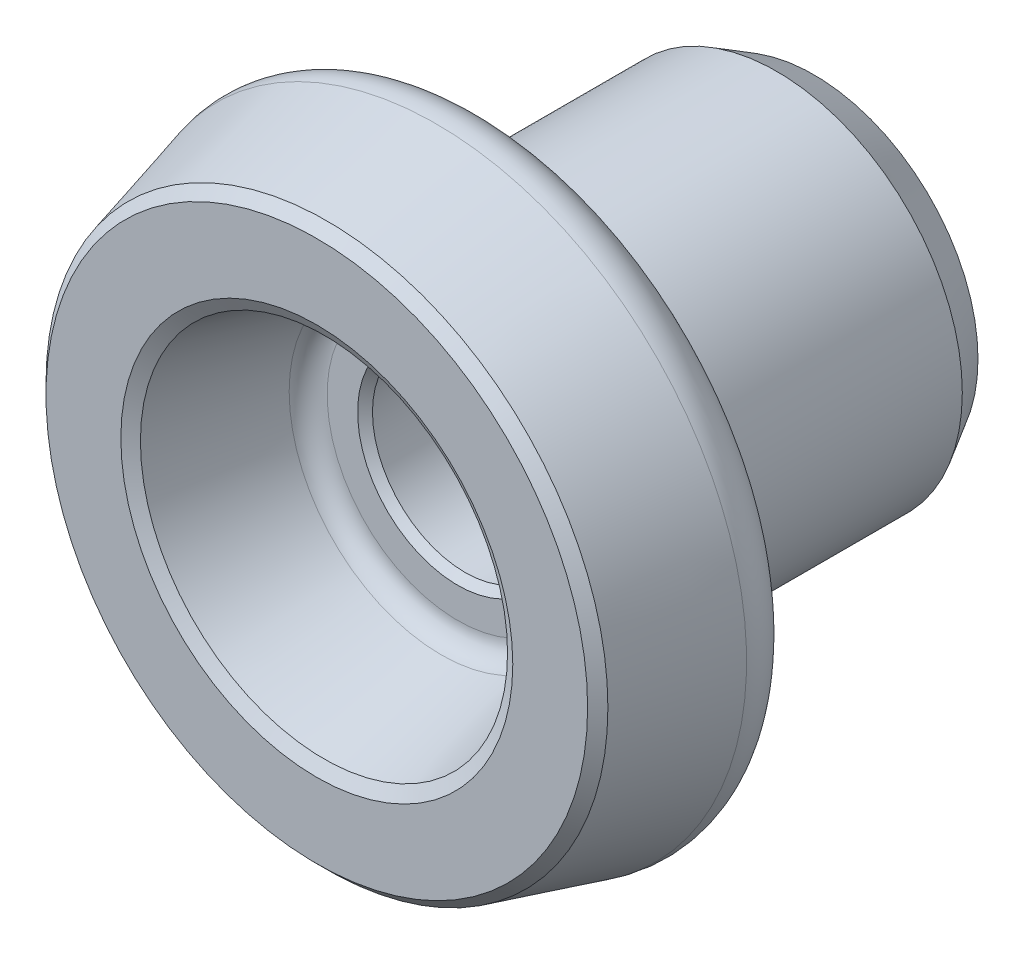
ISO-10303-21;
HEADER;
FILE_DESCRIPTION(('STEP AP214'),'2;1');
FILE_NAME('part.step','',(''),(''),'','','');
FILE_SCHEMA(('AUTOMOTIVE_DESIGN { 1 0 10303 214 1 1 1 1 }'));
ENDSEC;
DATA;
#1=APPLICATION_CONTEXT('core data for automotive mechanical design processes');
#2=APPLICATION_PROTOCOL_DEFINITION('international standard','automotive_design',2000,#1);
#3=PRODUCT_CONTEXT('',#1,'mechanical');
#4=PRODUCT('Part','Part','',(#3));
#5=PRODUCT_RELATED_PRODUCT_CATEGORY('part','',(#4));
#6=PRODUCT_DEFINITION_FORMATION('','',#4);
#7=PRODUCT_DEFINITION_CONTEXT('part definition',#1,'design');
#8=PRODUCT_DEFINITION('design','',#6,#7);
#9=PRODUCT_DEFINITION_SHAPE('','',#8);
#10=(LENGTH_UNIT() NAMED_UNIT(*) SI_UNIT(.MILLI.,.METRE.));
#11=(NAMED_UNIT(*) PLANE_ANGLE_UNIT() SI_UNIT($,.RADIAN.));
#12=(NAMED_UNIT(*) SI_UNIT($,.STERADIAN.) SOLID_ANGLE_UNIT());
#13=UNCERTAINTY_MEASURE_WITH_UNIT(LENGTH_MEASURE(1.E-05),#10,'distance_accuracy_value','');
#14=(GEOMETRIC_REPRESENTATION_CONTEXT(3) GLOBAL_UNCERTAINTY_ASSIGNED_CONTEXT((#13)) GLOBAL_UNIT_ASSIGNED_CONTEXT((#10,
#11,#12)) REPRESENTATION_CONTEXT('',''));
#15=CARTESIAN_POINT('',(0.,0.,0.));
#16=DIRECTION('',(0.,0.,1.));
#17=DIRECTION('',(1.,0.,0.));
#18=AXIS2_PLACEMENT_3D('',#15,#16,#17);
#19=CARTESIAN_POINT('',(0.,0.,-8.05525797624729));
#20=DIRECTION('',(0.,0.,-1.));
#21=DIRECTION('',(-1.,0.,0.));
#22=AXIS2_PLACEMENT_3D('',#19,#20,#21);
#23=CONICAL_SURFACE('',#22,20.9083998695598,0.261799387799146);
#24=CARTESIAN_POINT('',(0.,0.,-0.683012701892222));
#25=DIRECTION('',(0.,0.,1.));
#26=DIRECTION('',(1.,0.,0.));
#27=AXIS2_PLACEMENT_3D('',#24,#25,#26);
#28=CIRCLE('',#27,18.9330127018922);
#29=CARTESIAN_POINT('',(18.9330127018922,0.,-0.683012701892222));
#30=VERTEX_POINT('',#29);
#31=EDGE_CURVE('E68',#30,#30,#28,.F.);
#32=ORIENTED_EDGE('',*,*,#31,.T.);
#33=EDGE_LOOP('',(#32));
#34=FACE_BOUND('',#33,.T.);
#35=CARTESIAN_POINT('',(0.,0.,-8.05525797624729));
#36=DIRECTION('',(0.,0.,-1.));
#37=DIRECTION('',(-1.,0.,0.));
#38=AXIS2_PLACEMENT_3D('',#35,#36,#37);
#39=CIRCLE('',#38,20.9083998695598);
#40=CARTESIAN_POINT('',(-20.9083998695598,0.,-8.05525797624729));
#41=VERTEX_POINT('',#40);
#42=EDGE_CURVE('E92',#41,#41,#39,.T.);
#43=ORIENTED_EDGE('',*,*,#42,.F.);
#44=EDGE_LOOP('',(#43));
#45=FACE_BOUND('',#44,.T.);
#46=ADVANCED_FACE('F39',(#34,#45),#23,.T.);
#47=CARTESIAN_POINT('',(0.,12.5,0.));
#48=DIRECTION('',(0.,0.,1.));
#49=DIRECTION('',(1.,0.,0.));
#50=AXIS2_PLACEMENT_3D('',#47,#48,#49);
#51=PLANE('',#50);
#52=CARTESIAN_POINT('',(0.,0.,0.));
#53=DIRECTION('',(0.,0.,1.));
#54=DIRECTION('',(1.,0.,0.));
#55=AXIS2_PLACEMENT_3D('',#52,#53,#54);
#56=CIRCLE('',#55,18.25);
#57=CARTESIAN_POINT('',(18.25,0.,0.));
#58=VERTEX_POINT('',#57);
#59=EDGE_CURVE('E62',#58,#58,#56,.T.);
#60=ORIENTED_EDGE('',*,*,#59,.T.);
#61=EDGE_LOOP('',(#60));
#62=FACE_BOUND('',#61,.T.);
#63=CARTESIAN_POINT('',(0.,0.,0.));
#64=DIRECTION('',(0.,0.,1.));
#65=DIRECTION('',(1.,0.,0.));
#66=AXIS2_PLACEMENT_3D('',#63,#64,#65);
#67=CIRCLE('',#66,13.2071067811865);
#68=CARTESIAN_POINT('',(13.2071067811865,0.,0.));
#69=VERTEX_POINT('',#68);
#70=EDGE_CURVE('E65',#69,#69,#67,.F.);
#71=ORIENTED_EDGE('',*,*,#70,.T.);
#72=EDGE_LOOP('',(#71));
#73=FACE_BOUND('',#72,.T.);
#74=ADVANCED_FACE('F100',(#62,#73),#51,.T.);
#75=CARTESIAN_POINT('',(0.,0.,0.));
#76=DIRECTION('',(0.,0.,1.));
#77=DIRECTION('',(1.,0.,0.));
#78=AXIS2_PLACEMENT_3D('',#75,#76,#77);
#79=CONICAL_SURFACE('',#78,12.5,0.26179938779915);
#80=CARTESIAN_POINT('',(0.,0.,-8.38822856765378));
#81=DIRECTION('',(0.,0.,1.));
#82=DIRECTION('',(1.,0.,0.));
#83=AXIS2_PLACEMENT_3D('',#80,#81,#82);
#84=CIRCLE('',#83,10.2523809293695);
#85=CARTESIAN_POINT('',(10.2523809293695,0.,-8.38822856765378));
#86=VERTEX_POINT('',#85);
#87=EDGE_CURVE('E54',#86,#86,#84,.F.);
#88=ORIENTED_EDGE('',*,*,#87,.T.);
#89=EDGE_LOOP('',(#88));
#90=FACE_BOUND('',#89,.T.);
#91=CARTESIAN_POINT('',(0.,0.,-0.482962913144536));
#92=DIRECTION('',(0.,0.,-1.));
#93=DIRECTION('',(-1.,0.,0.));
#94=AXIS2_PLACEMENT_3D('',#91,#92,#93);
#95=CIRCLE('',#94,12.3705904774487);
#96=CARTESIAN_POINT('',(-12.3705904774487,0.,-0.482962913144536));
#97=VERTEX_POINT('',#96);
#98=EDGE_CURVE('E59',#97,#97,#95,.F.);
#99=ORIENTED_EDGE('',*,*,#98,.T.);
#100=EDGE_LOOP('',(#99));
#101=FACE_BOUND('',#100,.T.);
#102=ADVANCED_FACE('F107',(#90,#101),#79,.F.);
#103=CARTESIAN_POINT('',(0.,6.25,-9.5));
#104=DIRECTION('',(0.,0.,1.));
#105=DIRECTION('',(1.,0.,0.));
#106=AXIS2_PLACEMENT_3D('',#103,#104,#105);
#107=PLANE('',#106);
#108=CARTESIAN_POINT('',(0.,0.,-9.5));
#109=DIRECTION('',(0.,0.,1.));
#110=DIRECTION('',(1.,0.,0.));
#111=AXIS2_PLACEMENT_3D('',#108,#109,#110);
#112=CIRCLE('',#111,8.80349218993589);
#113=CARTESIAN_POINT('',(8.80349218993589,0.,-9.5));
#114=VERTEX_POINT('',#113);
#115=EDGE_CURVE('E50',#114,#114,#112,.T.);
#116=ORIENTED_EDGE('',*,*,#115,.T.);
#117=EDGE_LOOP('',(#116));
#118=FACE_BOUND('',#117,.T.);
#119=CARTESIAN_POINT('',(0.,0.,-9.5));
#120=DIRECTION('',(0.,0.,1.));
#121=DIRECTION('',(1.,0.,0.));
#122=AXIS2_PLACEMENT_3D('',#119,#120,#121);
#123=CIRCLE('',#122,6.75000000000001);
#124=CARTESIAN_POINT('',(6.75000000000001,0.,-9.5));
#125=VERTEX_POINT('',#124);
#126=EDGE_CURVE('E74',#125,#125,#123,.F.);
#127=ORIENTED_EDGE('',*,*,#126,.T.);
#128=EDGE_LOOP('',(#127));
#129=FACE_BOUND('',#128,.T.);
#130=ADVANCED_FACE('F141',(#118,#129),#107,.T.);
#131=CARTESIAN_POINT('',(0.,0.,0.));
#132=DIRECTION('',(0.,0.,-1.));
#133=DIRECTION('',(-1.,0.,0.));
#134=AXIS2_PLACEMENT_3D('',#131,#132,#133);
#135=CYLINDRICAL_SURFACE('',#134,6.25);
#136=CARTESIAN_POINT('',(0.,0.,-10.));
#137=DIRECTION('',(0.,0.,1.));
#138=DIRECTION('',(1.,0.,0.));
#139=AXIS2_PLACEMENT_3D('',#136,#137,#138);
#140=CIRCLE('',#139,6.25);
#141=CARTESIAN_POINT('',(6.25,0.,-10.));
#142=VERTEX_POINT('',#141);
#143=EDGE_CURVE('E71',#142,#142,#140,.T.);
#144=ORIENTED_EDGE('',*,*,#143,.T.);
#145=EDGE_LOOP('',(#144));
#146=FACE_BOUND('',#145,.T.);
#147=CARTESIAN_POINT('',(0.,0.,-32.5));
#148=DIRECTION('',(0.,0.,-1.));
#149=DIRECTION('',(-1.,0.,0.));
#150=AXIS2_PLACEMENT_3D('',#147,#148,#149);
#151=CIRCLE('',#150,6.25);
#152=CARTESIAN_POINT('',(-6.25,0.,-32.5));
#153=VERTEX_POINT('',#152);
#154=EDGE_CURVE('E80',#153,#153,#151,.T.);
#155=ORIENTED_EDGE('',*,*,#154,.T.);
#156=EDGE_LOOP('',(#155));
#157=FACE_BOUND('',#156,.T.);
#158=ADVANCED_FACE('F148',(#146,#157),#135,.F.);
#159=CARTESIAN_POINT('',(0.,11.0566243270259,-33.5));
#160=DIRECTION('',(0.,0.,-1.));
#161=DIRECTION('',(-1.,0.,0.));
#162=AXIS2_PLACEMENT_3D('',#159,#160,#161);
#163=PLANE('',#162);
#164=CARTESIAN_POINT('',(0.,0.,-33.5));
#165=DIRECTION('',(0.,0.,-1.));
#166=DIRECTION('',(-1.,0.,0.));
#167=AXIS2_PLACEMENT_3D('',#164,#165,#166);
#168=CIRCLE('',#167,7.25000000000005);
#169=CARTESIAN_POINT('',(-7.25000000000005,0.,-33.5));
#170=VERTEX_POINT('',#169);
#171=EDGE_CURVE('E77',#170,#170,#168,.F.);
#172=ORIENTED_EDGE('',*,*,#171,.T.);
#173=EDGE_LOOP('',(#172));
#174=FACE_BOUND('',#173,.T.);
#175=CARTESIAN_POINT('',(0.,0.,-33.5));
#176=DIRECTION('',(0.,0.,-1.));
#177=DIRECTION('',(-1.,0.,0.));
#178=AXIS2_PLACEMENT_3D('',#175,#176,#177);
#179=CIRCLE('',#178,11.0566243270259);
#180=CARTESIAN_POINT('',(-11.0566243270259,0.,-33.5));
#181=VERTEX_POINT('',#180);
#182=EDGE_CURVE('E83',#181,#181,#179,.T.);
#183=ORIENTED_EDGE('',*,*,#182,.T.);
#184=EDGE_LOOP('',(#183));
#185=FACE_BOUND('',#184,.T.);
#186=ADVANCED_FACE('F154',(#174,#185),#163,.T.);
#187=CARTESIAN_POINT('',(0.,0.,-33.5));
#188=DIRECTION('',(0.,0.,1.));
#189=DIRECTION('',(1.,0.,0.));
#190=AXIS2_PLACEMENT_3D('',#187,#188,#189);
#191=CONICAL_SURFACE('',#190,11.0566243270259,0.5235987755983);
#192=CARTESIAN_POINT('',(0.,0.,-31.));
#193=DIRECTION('',(0.,0.,-1.));
#194=DIRECTION('',(-1.,0.,0.));
#195=AXIS2_PLACEMENT_3D('',#192,#193,#194);
#196=CIRCLE('',#195,12.5);
#197=CARTESIAN_POINT('',(-12.5,0.,-31.));
#198=VERTEX_POINT('',#197);
#199=EDGE_CURVE('E86',#198,#198,#196,.T.);
#200=ORIENTED_EDGE('',*,*,#199,.T.);
#201=EDGE_LOOP('',(#200));
#202=FACE_BOUND('',#201,.T.);
#203=ORIENTED_EDGE('',*,*,#182,.F.);
#204=EDGE_LOOP('',(#203));
#205=FACE_BOUND('',#204,.T.);
#206=ADVANCED_FACE('F158',(#202,#205),#191,.T.);
#207=CARTESIAN_POINT('',(0.,0.,0.));
#208=DIRECTION('',(0.,0.,-1.));
#209=DIRECTION('',(-1.,0.,0.));
#210=AXIS2_PLACEMENT_3D('',#207,#208,#209);
#211=CYLINDRICAL_SURFACE('',#210,12.5);
#212=CARTESIAN_POINT('',(0.,0.,-14.9183174699474));
#213=DIRECTION('',(0.,0.,-1.));
#214=DIRECTION('',(-1.,0.,0.));
#215=AXIS2_PLACEMENT_3D('',#212,#213,#214);
#216=CIRCLE('',#215,12.5);
#217=CARTESIAN_POINT('',(-12.5,0.,-14.9183174699474));
#218=VERTEX_POINT('',#217);
#219=EDGE_CURVE('E46',#218,#218,#216,.T.);
#220=ORIENTED_EDGE('',*,*,#219,.T.);
#221=EDGE_LOOP('',(#220));
#222=FACE_BOUND('',#221,.T.);
#223=ORIENTED_EDGE('',*,*,#199,.F.);
#224=EDGE_LOOP('',(#223));
#225=FACE_BOUND('',#224,.T.);
#226=ADVANCED_FACE('F162',(#222,#225),#211,.T.);
#227=CARTESIAN_POINT('',(0.,0.,-13.));
#228=DIRECTION('',(0.,0.,1.));
#229=DIRECTION('',(1.,0.,0.));
#230=AXIS2_PLACEMENT_3D('',#227,#228,#229);
#231=CONICAL_SURFACE('',#230,12.5,1.30899693899575);
#232=CARTESIAN_POINT('',(0.,0.,-12.5035029042247));
#233=DIRECTION('',(0.,0.,1.));
#234=DIRECTION('',(1.,0.,0.));
#235=AXIS2_PLACEMENT_3D('',#232,#233,#234);
#236=CIRCLE('',#235,14.3529523872437);
#237=CARTESIAN_POINT('',(14.3529523872437,0.,-12.5035029042247));
#238=VERTEX_POINT('',#237);
#239=EDGE_CURVE('E10',#238,#238,#236,.T.);
#240=ORIENTED_EDGE('',*,*,#239,.T.);
#241=EDGE_LOOP('',(#240));
#242=FACE_BOUND('',#241,.T.);
#243=CARTESIAN_POINT('',(0.,0.,-11.2395946418654));
#244=DIRECTION('',(0.,0.,-1.));
#245=DIRECTION('',(-1.,0.,0.));
#246=AXIS2_PLACEMENT_3D('',#243,#244,#245);
#247=CIRCLE('',#246,19.0699222384748);
#248=CARTESIAN_POINT('',(-19.0699222384748,0.,-11.2395946418654));
#249=VERTEX_POINT('',#248);
#250=EDGE_CURVE('E89',#249,#249,#247,.T.);
#251=ORIENTED_EDGE('',*,*,#250,.T.);
#252=EDGE_LOOP('',(#251));
#253=FACE_BOUND('',#252,.T.);
#254=ADVANCED_FACE('F165',(#242,#253),#231,.T.);
#255=CARTESIAN_POINT('',(0.,0.,-8.72818749351383));
#256=DIRECTION('',(0.,0.,-1.));
#257=DIRECTION('',(-1.,0.,0.));
#258=AXIS2_PLACEMENT_3D('',#255,#256,#257);
#259=TOROIDAL_SURFACE('',#258,18.3969927212082,2.6);
#260=ORIENTED_EDGE('',*,*,#42,.T.);
#261=EDGE_LOOP('',(#260));
#262=FACE_BOUND('',#261,.T.);
#263=ORIENTED_EDGE('',*,*,#250,.F.);
#264=EDGE_LOOP('',(#263));
#265=FACE_BOUND('',#264,.T.);
#266=ADVANCED_FACE('F96',(#262,#265),#259,.T.);
#267=CARTESIAN_POINT('',(0.,0.,-32.5));
#268=DIRECTION('',(0.,0.,-1.));
#269=DIRECTION('',(-1.,0.,0.));
#270=AXIS2_PLACEMENT_3D('',#267,#268,#269);
#271=CONICAL_SURFACE('',#270,6.25,0.785398163397453);
#272=ORIENTED_EDGE('',*,*,#171,.F.);
#273=EDGE_LOOP('',(#272));
#274=FACE_BOUND('',#273,.T.);
#275=ORIENTED_EDGE('',*,*,#154,.F.);
#276=EDGE_LOOP('',(#275));
#277=FACE_BOUND('',#276,.T.);
#278=ADVANCED_FACE('F112',(#274,#277),#271,.F.);
#279=CARTESIAN_POINT('',(0.,0.,-9.5));
#280=DIRECTION('',(0.,0.,1.));
#281=DIRECTION('',(1.,0.,0.));
#282=AXIS2_PLACEMENT_3D('',#279,#280,#281);
#283=CONICAL_SURFACE('',#282,6.75000000000001,0.785398163397448);
#284=ORIENTED_EDGE('',*,*,#143,.F.);
#285=EDGE_LOOP('',(#284));
#286=FACE_BOUND('',#285,.T.);
#287=ORIENTED_EDGE('',*,*,#126,.F.);
#288=EDGE_LOOP('',(#287));
#289=FACE_BOUND('',#288,.T.);
#290=ADVANCED_FACE('F114',(#286,#289),#283,.F.);
#291=CARTESIAN_POINT('',(0.,0.,-0.68301270189222));
#292=DIRECTION('',(0.,0.,-1.));
#293=DIRECTION('',(-1.,0.,0.));
#294=AXIS2_PLACEMENT_3D('',#291,#292,#293);
#295=CONICAL_SURFACE('',#294,18.9330127018922,0.785398163397447);
#296=ORIENTED_EDGE('',*,*,#59,.F.);
#297=EDGE_LOOP('',(#296));
#298=FACE_BOUND('',#297,.T.);
#299=ORIENTED_EDGE('',*,*,#31,.F.);
#300=EDGE_LOOP('',(#299));
#301=FACE_BOUND('',#300,.T.);
#302=ADVANCED_FACE('F118',(#298,#301),#295,.T.);
#303=CARTESIAN_POINT('',(0.,0.,0.));
#304=DIRECTION('',(0.,0.,1.));
#305=DIRECTION('',(1.,0.,0.));
#306=AXIS2_PLACEMENT_3D('',#303,#304,#305);
#307=CONICAL_SURFACE('',#306,13.2071067811865,1.0471975511966);
#308=ORIENTED_EDGE('',*,*,#98,.F.);
#309=EDGE_LOOP('',(#308));
#310=FACE_BOUND('',#309,.T.);
#311=ORIENTED_EDGE('',*,*,#70,.F.);
#312=EDGE_LOOP('',(#311));
#313=FACE_BOUND('',#312,.T.);
#314=ADVANCED_FACE('F122',(#310,#313),#307,.F.);
#315=CARTESIAN_POINT('',(0.,0.,-8.));
#316=DIRECTION('',(0.,0.,1.));
#317=DIRECTION('',(1.,0.,0.));
#318=AXIS2_PLACEMENT_3D('',#315,#316,#317);
#319=TOROIDAL_SURFACE('',#318,8.80349218993589,1.5);
#320=ORIENTED_EDGE('',*,*,#115,.F.);
#321=EDGE_LOOP('',(#320));
#322=FACE_BOUND('',#321,.T.);
#323=ORIENTED_EDGE('',*,*,#87,.F.);
#324=EDGE_LOOP('',(#323));
#325=FACE_BOUND('',#324,.T.);
#326=ADVANCED_FACE('F125',(#322,#325),#319,.F.);
#327=CARTESIAN_POINT('',(0.,0.,-14.9183174699474));
#328=DIRECTION('',(0.,0.,-1.));
#329=DIRECTION('',(-1.,0.,0.));
#330=AXIS2_PLACEMENT_3D('',#327,#328,#329);
#331=TOROIDAL_SURFACE('',#330,15.,2.5);
#332=ORIENTED_EDGE('',*,*,#239,.F.);
#333=EDGE_LOOP('',(#332));
#334=FACE_BOUND('',#333,.T.);
#335=ORIENTED_EDGE('',*,*,#219,.F.);
#336=EDGE_LOOP('',(#335));
#337=FACE_BOUND('',#336,.T.);
#338=ADVANCED_FACE('F41',(#334,#337),#331,.F.);
#339=CLOSED_SHELL('',(#46,#74,#102,#130,#158,#186,#206,#226,#254,#266,#278,#290,#302,#314,#326,#338));
#340=MANIFOLD_SOLID_BREP('B2',#339);
#341=ADVANCED_BREP_SHAPE_REPRESENTATION('',(#18,#340),#14);
#342=SHAPE_DEFINITION_REPRESENTATION(#9,#341);
ENDSEC;
END-ISO-10303-21;
